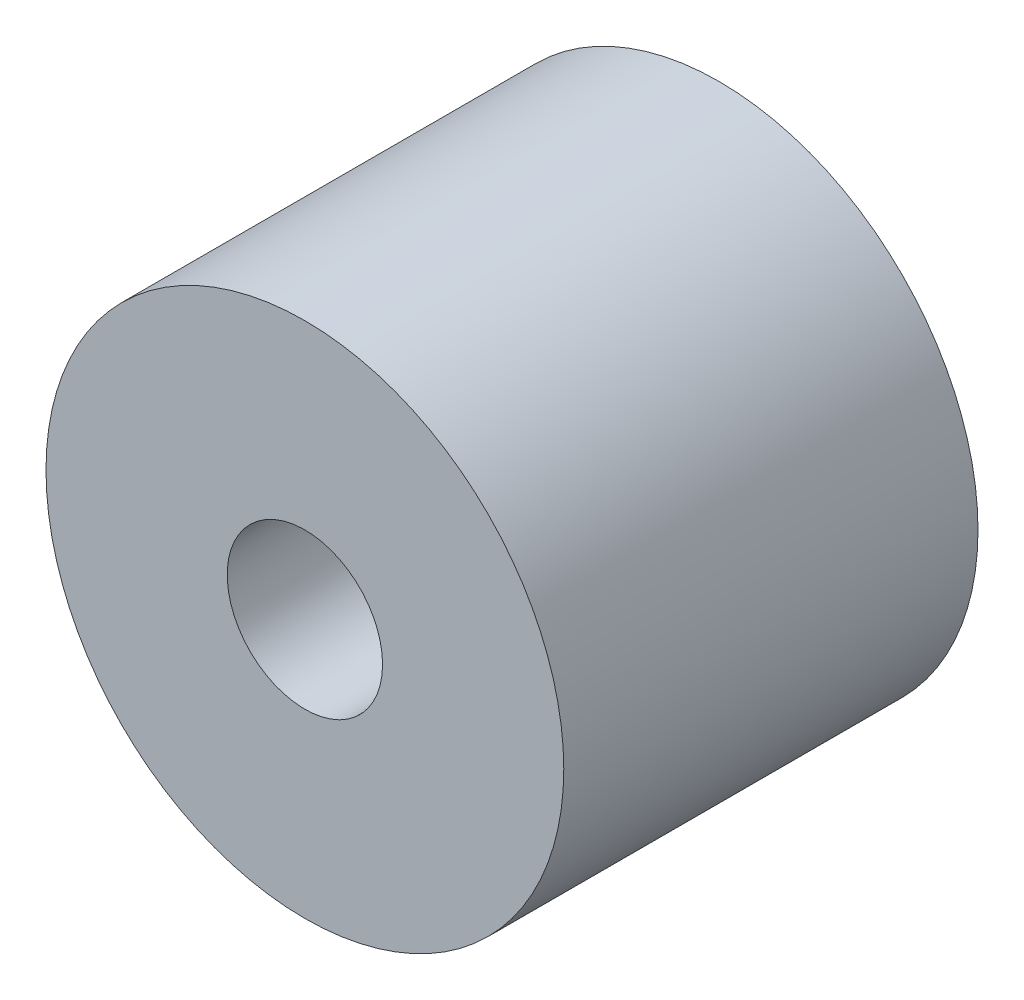
ISO-10303-21;
HEADER;
FILE_DESCRIPTION(('STEP AP214'),'2;1');
FILE_NAME('part.step','',(''),(''),'','','');
FILE_SCHEMA(('AUTOMOTIVE_DESIGN { 1 0 10303 214 1 1 1 1 }'));
ENDSEC;
DATA;
#1=APPLICATION_CONTEXT('core data for automotive mechanical design processes');
#2=APPLICATION_PROTOCOL_DEFINITION('international standard','automotive_design',2000,#1);
#3=PRODUCT_CONTEXT('',#1,'mechanical');
#4=PRODUCT('Part','Part','',(#3));
#5=PRODUCT_RELATED_PRODUCT_CATEGORY('part','',(#4));
#6=PRODUCT_DEFINITION_FORMATION('','',#4);
#7=PRODUCT_DEFINITION_CONTEXT('part definition',#1,'design');
#8=PRODUCT_DEFINITION('design','',#6,#7);
#9=PRODUCT_DEFINITION_SHAPE('','',#8);
#10=(LENGTH_UNIT() NAMED_UNIT(*) SI_UNIT(.MILLI.,.METRE.));
#11=(NAMED_UNIT(*) PLANE_ANGLE_UNIT() SI_UNIT($,.RADIAN.));
#12=(NAMED_UNIT(*) SI_UNIT($,.STERADIAN.) SOLID_ANGLE_UNIT());
#13=UNCERTAINTY_MEASURE_WITH_UNIT(LENGTH_MEASURE(1.E-05),#10,'distance_accuracy_value','');
#14=(GEOMETRIC_REPRESENTATION_CONTEXT(3) GLOBAL_UNCERTAINTY_ASSIGNED_CONTEXT((#13)) GLOBAL_UNIT_ASSIGNED_CONTEXT((#10,
#11,#12)) REPRESENTATION_CONTEXT('',''));
#15=CARTESIAN_POINT('',(0.,0.,0.));
#16=DIRECTION('',(0.,0.,1.));
#17=DIRECTION('',(1.,0.,0.));
#18=AXIS2_PLACEMENT_3D('',#15,#16,#17);
#19=CARTESIAN_POINT('',(-51.3929419829582,26.06620438704,8.));
#20=DIRECTION('',(0.,0.,1.));
#21=DIRECTION('',(1.,0.,0.));
#22=AXIS2_PLACEMENT_3D('',#19,#20,#21);
#23=PLANE('',#22);
#24=CARTESIAN_POINT('',(-51.3929419829582,26.06620438704,8.));
#25=DIRECTION('',(0.,0.,1.));
#26=DIRECTION('',(1.,0.,0.));
#27=AXIS2_PLACEMENT_3D('',#24,#25,#26);
#28=CIRCLE('',#27,5.);
#29=CARTESIAN_POINT('',(-46.3929419829582,26.06620438704,8.));
#30=VERTEX_POINT('',#29);
#31=EDGE_CURVE('E10',#30,#30,#28,.T.);
#32=ORIENTED_EDGE('',*,*,#31,.T.);
#33=EDGE_LOOP('',(#32));
#34=FACE_BOUND('',#33,.T.);
#35=CARTESIAN_POINT('',(-51.3929419829582,26.06620438704,8.));
#36=DIRECTION('',(0.,0.,1.));
#37=DIRECTION('',(1.,0.,0.));
#38=AXIS2_PLACEMENT_3D('',#35,#36,#37);
#39=CIRCLE('',#38,1.5);
#40=CARTESIAN_POINT('',(-49.8929419829582,26.06620438704,8.));
#41=VERTEX_POINT('',#40);
#42=EDGE_CURVE('E42',#41,#41,#39,.T.);
#43=ORIENTED_EDGE('',*,*,#42,.F.);
#44=EDGE_LOOP('',(#43));
#45=FACE_BOUND('',#44,.T.);
#46=ADVANCED_FACE('F31',(#34,#45),#23,.T.);
#47=CARTESIAN_POINT('',(-51.3929419829582,26.06620438704,0.));
#48=DIRECTION('',(0.,0.,1.));
#49=DIRECTION('',(1.,0.,0.));
#50=AXIS2_PLACEMENT_3D('',#47,#48,#49);
#51=PLANE('',#50);
#52=CARTESIAN_POINT('',(-51.3929419829582,26.06620438704,0.));
#53=DIRECTION('',(0.,0.,1.));
#54=DIRECTION('',(1.,0.,0.));
#55=AXIS2_PLACEMENT_3D('',#52,#53,#54);
#56=CIRCLE('',#55,5.);
#57=CARTESIAN_POINT('',(-46.3929419829582,26.06620438704,0.));
#58=VERTEX_POINT('',#57);
#59=EDGE_CURVE('E35',#58,#58,#56,.T.);
#60=ORIENTED_EDGE('',*,*,#59,.F.);
#61=EDGE_LOOP('',(#60));
#62=FACE_BOUND('',#61,.T.);
#63=CARTESIAN_POINT('',(-51.3929419829582,26.06620438704,0.));
#64=DIRECTION('',(0.,0.,1.));
#65=DIRECTION('',(1.,0.,0.));
#66=AXIS2_PLACEMENT_3D('',#63,#64,#65);
#67=CIRCLE('',#66,1.5);
#68=CARTESIAN_POINT('',(-49.8929419829582,26.06620438704,0.));
#69=VERTEX_POINT('',#68);
#70=EDGE_CURVE('E44',#69,#69,#67,.T.);
#71=ORIENTED_EDGE('',*,*,#70,.T.);
#72=EDGE_LOOP('',(#71));
#73=FACE_BOUND('',#72,.T.);
#74=ADVANCED_FACE('F54',(#62,#73),#51,.F.);
#75=CARTESIAN_POINT('',(-51.3929419829582,26.06620438704,8.));
#76=DIRECTION('',(0.,0.,-1.));
#77=DIRECTION('',(-1.,0.,0.));
#78=AXIS2_PLACEMENT_3D('',#75,#76,#77);
#79=CYLINDRICAL_SURFACE('',#78,5.);
#80=ORIENTED_EDGE('',*,*,#31,.F.);
#81=EDGE_LOOP('',(#80));
#82=FACE_BOUND('',#81,.T.);
#83=ORIENTED_EDGE('',*,*,#59,.T.);
#84=EDGE_LOOP('',(#83));
#85=FACE_BOUND('',#84,.T.);
#86=ADVANCED_FACE('F33',(#82,#85),#79,.T.);
#87=CARTESIAN_POINT('',(-51.3929419829582,26.06620438704,8.));
#88=DIRECTION('',(0.,0.,-1.));
#89=DIRECTION('',(-1.,0.,0.));
#90=AXIS2_PLACEMENT_3D('',#87,#88,#89);
#91=CYLINDRICAL_SURFACE('',#90,1.5);
#92=ORIENTED_EDGE('',*,*,#42,.T.);
#93=EDGE_LOOP('',(#92));
#94=FACE_BOUND('',#93,.T.);
#95=ORIENTED_EDGE('',*,*,#70,.F.);
#96=EDGE_LOOP('',(#95));
#97=FACE_BOUND('',#96,.T.);
#98=ADVANCED_FACE('F50',(#94,#97),#91,.F.);
#99=CLOSED_SHELL('',(#46,#74,#86,#98));
#100=MANIFOLD_SOLID_BREP('B2',#99);
#101=ADVANCED_BREP_SHAPE_REPRESENTATION('',(#18,#100),#14);
#102=SHAPE_DEFINITION_REPRESENTATION(#9,#101);
ENDSEC;
END-ISO-10303-21;
